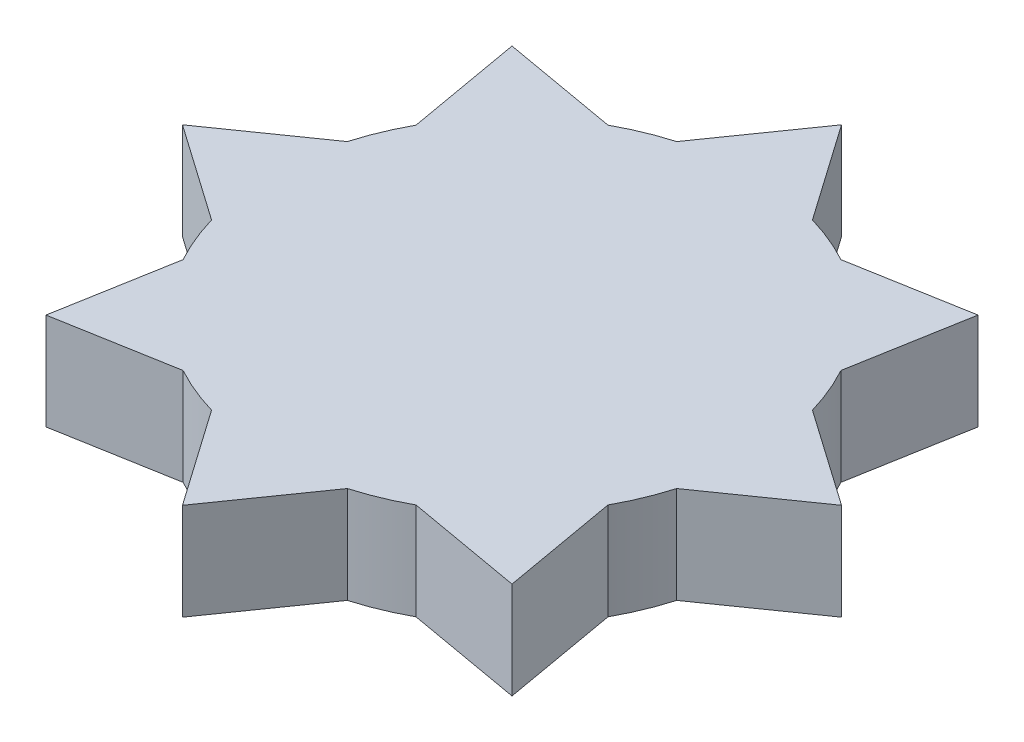
ISO-10303-21;
HEADER;
FILE_DESCRIPTION(('STEP AP214'),'2;1');
FILE_NAME('part.step','',(''),(''),'','','');
FILE_SCHEMA(('AUTOMOTIVE_DESIGN { 1 0 10303 214 1 1 1 1 }'));
ENDSEC;
DATA;
#1=APPLICATION_CONTEXT('core data for automotive mechanical design processes');
#2=APPLICATION_PROTOCOL_DEFINITION('international standard','automotive_design',2000,#1);
#3=PRODUCT_CONTEXT('',#1,'mechanical');
#4=PRODUCT('Part','Part','',(#3));
#5=PRODUCT_RELATED_PRODUCT_CATEGORY('part','',(#4));
#6=PRODUCT_DEFINITION_FORMATION('','',#4);
#7=PRODUCT_DEFINITION_CONTEXT('part definition',#1,'design');
#8=PRODUCT_DEFINITION('design','',#6,#7);
#9=PRODUCT_DEFINITION_SHAPE('','',#8);
#10=(LENGTH_UNIT() NAMED_UNIT(*) SI_UNIT(.MILLI.,.METRE.));
#11=(NAMED_UNIT(*) PLANE_ANGLE_UNIT() SI_UNIT($,.RADIAN.));
#12=(NAMED_UNIT(*) SI_UNIT($,.STERADIAN.) SOLID_ANGLE_UNIT());
#13=UNCERTAINTY_MEASURE_WITH_UNIT(LENGTH_MEASURE(1.E-05),#10,'distance_accuracy_value','');
#14=(GEOMETRIC_REPRESENTATION_CONTEXT(3) GLOBAL_UNCERTAINTY_ASSIGNED_CONTEXT((#13)) GLOBAL_UNIT_ASSIGNED_CONTEXT((#10,
#11,#12)) REPRESENTATION_CONTEXT('',''));
#15=CARTESIAN_POINT('',(0.,0.,0.));
#16=DIRECTION('',(0.,0.,1.));
#17=DIRECTION('',(1.,0.,0.));
#18=AXIS2_PLACEMENT_3D('',#15,#16,#17);
#19=CARTESIAN_POINT('',(15.9747745533604,10.,-11.1856575634635));
#20=DIRECTION('',(0.819152044288995,0.,-0.573576436351041));
#21=DIRECTION('',(-0.573576436351041,0.,-0.819152044288995));
#22=AXIS2_PLACEMENT_3D('',#19,#20,#21);
#23=PLANE('',#22);
#24=DIRECTION('',(0.573576436351042,0.,0.819152044288995));
#25=VECTOR('',#24,1.);
#26=CARTESIAN_POINT('',(15.9747745533604,0.,-11.1856575634635));
#27=LINE('',#26,#25);
#28=CARTESIAN_POINT('',(0.,0.,-34.));
#29=VERTEX_POINT('',#28);
#30=CARTESIAN_POINT('',(7.00260814364315,0.,-23.9992391376598));
#31=VERTEX_POINT('',#30);
#32=EDGE_CURVE('E226',#29,#31,#27,.T.);
#33=ORIENTED_EDGE('',*,*,#32,.F.);
#34=DIRECTION('',(0.,-1.,0.));
#35=VECTOR('',#34,1.);
#36=CARTESIAN_POINT('',(0.,10.,-34.));
#37=LINE('',#36,#35);
#38=CARTESIAN_POINT('',(0.,10.,-34.));
#39=VERTEX_POINT('',#38);
#40=EDGE_CURVE('E11',#39,#29,#37,.T.);
#41=ORIENTED_EDGE('',*,*,#40,.F.);
#42=DIRECTION('',(0.573576436351042,0.,0.819152044288995));
#43=VECTOR('',#42,1.);
#44=CARTESIAN_POINT('',(15.9747745533604,10.,-11.1856575634635));
#45=LINE('',#44,#43);
#46=CARTESIAN_POINT('',(7.00260814364315,10.,-23.9992391376598));
#47=VERTEX_POINT('',#46);
#48=EDGE_CURVE('E450',#39,#47,#45,.T.);
#49=ORIENTED_EDGE('',*,*,#48,.T.);
#50=DIRECTION('',(0.,-1.,0.));
#51=VECTOR('',#50,1.);
#52=CARTESIAN_POINT('',(7.00260814364315,10.,-23.9992391376598));
#53=LINE('',#52,#51);
#54=EDGE_CURVE('E133',#47,#31,#53,.T.);
#55=ORIENTED_EDGE('',*,*,#54,.T.);
#56=EDGE_LOOP('',(#33,#41,#49,#55));
#57=FACE_BOUND('',#56,.T.);
#58=ADVANCED_FACE('F35',(#57),#23,.T.);
#59=CARTESIAN_POINT('',(-15.9747745533604,10.,-11.1856575634635));
#60=DIRECTION('',(0.819152044288995,0.,0.573576436351041));
#61=DIRECTION('',(0.573576436351041,0.,-0.819152044288995));
#62=AXIS2_PLACEMENT_3D('',#59,#60,#61);
#63=PLANE('',#62);
#64=DIRECTION('',(-0.573576436351042,0.,0.819152044288995));
#65=VECTOR('',#64,1.);
#66=CARTESIAN_POINT('',(-15.9747745533604,0.,-11.1856575634635));
#67=LINE('',#66,#65);
#68=CARTESIAN_POINT('',(-7.00260814364315,0.,-23.9992391376598));
#69=VERTEX_POINT('',#68);
#70=EDGE_CURVE('E229',#29,#69,#67,.T.);
#71=ORIENTED_EDGE('',*,*,#70,.T.);
#72=DIRECTION('',(0.,-1.,0.));
#73=VECTOR('',#72,1.);
#74=CARTESIAN_POINT('',(-7.00260814364315,10.,-23.9992391376598));
#75=LINE('',#74,#73);
#76=CARTESIAN_POINT('',(-7.00260814364315,10.,-23.9992391376598));
#77=VERTEX_POINT('',#76);
#78=EDGE_CURVE('E43',#77,#69,#75,.T.);
#79=ORIENTED_EDGE('',*,*,#78,.F.);
#80=DIRECTION('',(-0.573576436351042,0.,0.819152044288995));
#81=VECTOR('',#80,1.);
#82=CARTESIAN_POINT('',(-15.9747745533604,10.,-11.1856575634635));
#83=LINE('',#82,#81);
#84=EDGE_CURVE('E342',#39,#77,#83,.T.);
#85=ORIENTED_EDGE('',*,*,#84,.F.);
#86=ORIENTED_EDGE('',*,*,#40,.T.);
#87=EDGE_LOOP('',(#71,#79,#85,#86));
#88=FACE_BOUND('',#87,.T.);
#89=ADVANCED_FACE('F452',(#88),#63,.F.);
#90=CARTESIAN_POINT('',(0.,10.,0.));
#91=DIRECTION('',(0.,-1.,0.));
#92=DIRECTION('',(0.,0.,-1.));
#93=AXIS2_PLACEMENT_3D('',#90,#91,#92);
#94=CYLINDRICAL_SURFACE('',#93,25.);
#95=CARTESIAN_POINT('',(0.,0.,0.));
#96=DIRECTION('',(0.,1.,0.));
#97=DIRECTION('',(0.,0.,1.));
#98=AXIS2_PLACEMENT_3D('',#95,#96,#97);
#99=CIRCLE('',#98,25.);
#100=CARTESIAN_POINT('',(-12.0184330331944,0.,-21.9216164419192));
#101=VERTEX_POINT('',#100);
#102=EDGE_CURVE('E231',#69,#101,#99,.T.);
#103=ORIENTED_EDGE('',*,*,#102,.T.);
#104=DIRECTION('',(0.,-1.,0.));
#105=VECTOR('',#104,1.);
#106=CARTESIAN_POINT('',(-12.0184330331944,10.,-21.9216164419192));
#107=LINE('',#106,#105);
#108=CARTESIAN_POINT('',(-12.0184330331944,10.,-21.9216164419192));
#109=VERTEX_POINT('',#108);
#110=EDGE_CURVE('E316',#109,#101,#107,.T.);
#111=ORIENTED_EDGE('',*,*,#110,.F.);
#112=CARTESIAN_POINT('',(0.,10.,0.));
#113=DIRECTION('',(0.,1.,0.));
#114=DIRECTION('',(0.,0.,1.));
#115=AXIS2_PLACEMENT_3D('',#112,#113,#114);
#116=CIRCLE('',#115,25.);
#117=EDGE_CURVE('E324',#77,#109,#116,.T.);
#118=ORIENTED_EDGE('',*,*,#117,.F.);
#119=ORIENTED_EDGE('',*,*,#78,.T.);
#120=EDGE_LOOP('',(#103,#111,#118,#119));
#121=FACE_BOUND('',#120,.T.);
#122=ADVANCED_FACE('F322',(#121),#94,.T.);
#123=CARTESIAN_POINT('',(3.38641709945205,10.,-19.205325729763));
#124=DIRECTION('',(0.173648177666948,0.,-0.984807753012205));
#125=DIRECTION('',(-0.984807753012205,0.,-0.173648177666948));
#126=AXIS2_PLACEMENT_3D('',#123,#124,#125);
#127=PLANE('',#126);
#128=DIRECTION('',(0.984807753012205,0.,0.173648177666948));
#129=VECTOR('',#128,1.);
#130=CARTESIAN_POINT('',(3.38641709945205,0.,-19.205325729763));
#131=LINE('',#130,#129);
#132=CARTESIAN_POINT('',(-24.0416305603423,0.,-24.0416305603429));
#133=VERTEX_POINT('',#132);
#134=EDGE_CURVE('E234',#133,#101,#131,.T.);
#135=ORIENTED_EDGE('',*,*,#134,.F.);
#136=DIRECTION('',(0.,-1.,0.));
#137=VECTOR('',#136,1.);
#138=CARTESIAN_POINT('',(-24.0416305603423,10.,-24.0416305603429));
#139=LINE('',#138,#137);
#140=CARTESIAN_POINT('',(-24.0416305603423,10.,-24.0416305603429));
#141=VERTEX_POINT('',#140);
#142=EDGE_CURVE('E314',#141,#133,#139,.T.);
#143=ORIENTED_EDGE('',*,*,#142,.F.);
#144=DIRECTION('',(0.984807753012205,0.,0.173648177666948));
#145=VECTOR('',#144,1.);
#146=CARTESIAN_POINT('',(3.38641709945205,10.,-19.205325729763));
#147=LINE('',#146,#145);
#148=EDGE_CURVE('E337',#141,#109,#147,.T.);
#149=ORIENTED_EDGE('',*,*,#148,.T.);
#150=ORIENTED_EDGE('',*,*,#110,.T.);
#151=EDGE_LOOP('',(#135,#143,#149,#150));
#152=FACE_BOUND('',#151,.T.);
#153=ADVANCED_FACE('F333',(#152),#127,.T.);
#154=CARTESIAN_POINT('',(-19.2053257297631,10.,3.38641709945159));
#155=DIRECTION('',(0.984807753012209,0.,-0.173648177666924));
#156=DIRECTION('',(-0.173648177666924,0.,-0.984807753012209));
#157=AXIS2_PLACEMENT_3D('',#154,#155,#156);
#158=PLANE('',#157);
#159=DIRECTION('',(0.173648177666924,0.,0.984807753012209));
#160=VECTOR('',#159,1.);
#161=CARTESIAN_POINT('',(-19.2053257297631,0.,3.38641709945159));
#162=LINE('',#161,#160);
#163=CARTESIAN_POINT('',(-21.9216164419189,0.,-12.0184330331949));
#164=VERTEX_POINT('',#163);
#165=EDGE_CURVE('E239',#133,#164,#162,.T.);
#166=ORIENTED_EDGE('',*,*,#165,.T.);
#167=DIRECTION('',(0.,-1.,0.));
#168=VECTOR('',#167,1.);
#169=CARTESIAN_POINT('',(-21.9216164419189,10.,-12.0184330331949));
#170=LINE('',#169,#168);
#171=CARTESIAN_POINT('',(-21.9216164419189,10.,-12.0184330331949));
#172=VERTEX_POINT('',#171);
#173=EDGE_CURVE('E311',#172,#164,#170,.T.);
#174=ORIENTED_EDGE('',*,*,#173,.F.);
#175=DIRECTION('',(0.173648177666924,0.,0.984807753012209));
#176=VECTOR('',#175,1.);
#177=CARTESIAN_POINT('',(-19.2053257297631,10.,3.38641709945159));
#178=LINE('',#177,#176);
#179=EDGE_CURVE('E338',#141,#172,#178,.T.);
#180=ORIENTED_EDGE('',*,*,#179,.F.);
#181=ORIENTED_EDGE('',*,*,#142,.T.);
#182=EDGE_LOOP('',(#166,#174,#180,#181));
#183=FACE_BOUND('',#182,.T.);
#184=ADVANCED_FACE('F463',(#183),#158,.F.);
#185=CARTESIAN_POINT('',(-23.9992391376597,0.,-7.00260814364341));
#186=VERTEX_POINT('',#185);
#187=EDGE_CURVE('E236',#164,#186,#99,.T.);
#188=ORIENTED_EDGE('',*,*,#187,.T.);
#189=DIRECTION('',(0.,-1.,0.));
#190=VECTOR('',#189,1.);
#191=CARTESIAN_POINT('',(-23.9992391376597,10.,-7.00260814364341));
#192=LINE('',#191,#190);
#193=CARTESIAN_POINT('',(-23.9992391376597,10.,-7.00260814364341));
#194=VERTEX_POINT('',#193);
#195=EDGE_CURVE('E309',#194,#186,#192,.T.);
#196=ORIENTED_EDGE('',*,*,#195,.F.);
#197=EDGE_CURVE('E340',#172,#194,#116,.T.);
#198=ORIENTED_EDGE('',*,*,#197,.F.);
#199=ORIENTED_EDGE('',*,*,#173,.T.);
#200=EDGE_LOOP('',(#188,#196,#198,#199));
#201=FACE_BOUND('',#200,.T.);
#202=ADVANCED_FACE('F388',(#201),#94,.T.);
#203=CARTESIAN_POINT('',(-11.1856575634633,10.,-15.9747745533605));
#204=DIRECTION('',(-0.573576436351033,0.,-0.819152044289001));
#205=DIRECTION('',(-0.819152044289001,0.,0.573576436351033));
#206=AXIS2_PLACEMENT_3D('',#203,#204,#205);
#207=PLANE('',#206);
#208=DIRECTION('',(0.819152044289001,0.,-0.573576436351033));
#209=VECTOR('',#208,1.);
#210=CARTESIAN_POINT('',(-11.1856575634633,0.,-15.9747745533605));
#211=LINE('',#210,#209);
#212=CARTESIAN_POINT('',(-34.,0.,-3.57353036051222E-13));
#213=VERTEX_POINT('',#212);
#214=EDGE_CURVE('E241',#213,#186,#211,.T.);
#215=ORIENTED_EDGE('',*,*,#214,.F.);
#216=DIRECTION('',(0.,-1.,0.));
#217=VECTOR('',#216,1.);
#218=CARTESIAN_POINT('',(-34.,10.,-3.57353036051222E-13));
#219=LINE('',#218,#217);
#220=CARTESIAN_POINT('',(-34.,10.,-3.57353036051222E-13));
#221=VERTEX_POINT('',#220);
#222=EDGE_CURVE('E307',#221,#213,#219,.T.);
#223=ORIENTED_EDGE('',*,*,#222,.F.);
#224=DIRECTION('',(0.819152044289001,0.,-0.573576436351033));
#225=VECTOR('',#224,1.);
#226=CARTESIAN_POINT('',(-11.1856575634633,10.,-15.9747745533605));
#227=LINE('',#226,#225);
#228=EDGE_CURVE('E345',#221,#194,#227,.T.);
#229=ORIENTED_EDGE('',*,*,#228,.T.);
#230=ORIENTED_EDGE('',*,*,#195,.T.);
#231=EDGE_LOOP('',(#215,#223,#229,#230));
#232=FACE_BOUND('',#231,.T.);
#233=ADVANCED_FACE('F391',(#232),#207,.T.);
#234=CARTESIAN_POINT('',(-11.1856575634636,10.,15.9747745533603));
#235=DIRECTION('',(0.57357643635105,0.,-0.819152044288989));
#236=DIRECTION('',(-0.819152044288989,0.,-0.57357643635105));
#237=AXIS2_PLACEMENT_3D('',#234,#235,#236);
#238=PLANE('',#237);
#239=DIRECTION('',(0.819152044288989,0.,0.57357643635105));
#240=VECTOR('',#239,1.);
#241=CARTESIAN_POINT('',(-11.1856575634636,0.,15.9747745533603));
#242=LINE('',#241,#240);
#243=CARTESIAN_POINT('',(-23.9992391376599,0.,7.0026081436429));
#244=VERTEX_POINT('',#243);
#245=EDGE_CURVE('E244',#213,#244,#242,.T.);
#246=ORIENTED_EDGE('',*,*,#245,.T.);
#247=DIRECTION('',(0.,-1.,0.));
#248=VECTOR('',#247,1.);
#249=CARTESIAN_POINT('',(-23.9992391376599,10.,7.0026081436429));
#250=LINE('',#249,#248);
#251=CARTESIAN_POINT('',(-23.9992391376599,10.,7.0026081436429));
#252=VERTEX_POINT('',#251);
#253=EDGE_CURVE('E304',#252,#244,#250,.T.);
#254=ORIENTED_EDGE('',*,*,#253,.F.);
#255=DIRECTION('',(0.819152044288989,0.,0.57357643635105));
#256=VECTOR('',#255,1.);
#257=CARTESIAN_POINT('',(-11.1856575634636,10.,15.9747745533603));
#258=LINE('',#257,#256);
#259=EDGE_CURVE('E348',#221,#252,#258,.T.);
#260=ORIENTED_EDGE('',*,*,#259,.F.);
#261=ORIENTED_EDGE('',*,*,#222,.T.);
#262=EDGE_LOOP('',(#246,#254,#260,#261));
#263=FACE_BOUND('',#262,.T.);
#264=ADVANCED_FACE('F396',(#263),#238,.F.);
#265=CARTESIAN_POINT('',(-21.9216164419192,0.,12.0184330331944));
#266=VERTEX_POINT('',#265);
#267=EDGE_CURVE('E246',#244,#266,#99,.T.);
#268=ORIENTED_EDGE('',*,*,#267,.T.);
#269=DIRECTION('',(0.,-1.,0.));
#270=VECTOR('',#269,1.);
#271=CARTESIAN_POINT('',(-21.9216164419192,10.,12.0184330331944));
#272=LINE('',#271,#270);
#273=CARTESIAN_POINT('',(-21.9216164419192,10.,12.0184330331944));
#274=VERTEX_POINT('',#273);
#275=EDGE_CURVE('E302',#274,#266,#272,.T.);
#276=ORIENTED_EDGE('',*,*,#275,.F.);
#277=EDGE_CURVE('E350',#252,#274,#116,.T.);
#278=ORIENTED_EDGE('',*,*,#277,.F.);
#279=ORIENTED_EDGE('',*,*,#253,.T.);
#280=EDGE_LOOP('',(#268,#276,#278,#279));
#281=FACE_BOUND('',#280,.T.);
#282=ADVANCED_FACE('F400',(#281),#94,.T.);
#283=CARTESIAN_POINT('',(-19.205325729763,10.,-3.38641709945199));
#284=DIRECTION('',(-0.984807753012206,0.,-0.173648177666944));
#285=DIRECTION('',(-0.173648177666944,0.,0.984807753012206));
#286=AXIS2_PLACEMENT_3D('',#283,#284,#285);
#287=PLANE('',#286);
#288=DIRECTION('',(0.173648177666944,0.,-0.984807753012206));
#289=VECTOR('',#288,1.);
#290=CARTESIAN_POINT('',(-19.205325729763,0.,-3.38641709945199));
#291=LINE('',#290,#289);
#292=CARTESIAN_POINT('',(-24.0416305603428,0.,24.0416305603424));
#293=VERTEX_POINT('',#292);
#294=EDGE_CURVE('E247',#293,#266,#291,.T.);
#295=ORIENTED_EDGE('',*,*,#294,.F.);
#296=DIRECTION('',(0.,-1.,0.));
#297=VECTOR('',#296,1.);
#298=CARTESIAN_POINT('',(-24.0416305603428,10.,24.0416305603424));
#299=LINE('',#298,#297);
#300=CARTESIAN_POINT('',(-24.0416305603428,10.,24.0416305603424));
#301=VERTEX_POINT('',#300);
#302=EDGE_CURVE('E300',#301,#293,#299,.T.);
#303=ORIENTED_EDGE('',*,*,#302,.F.);
#304=DIRECTION('',(0.173648177666944,0.,-0.984807753012206));
#305=VECTOR('',#304,1.);
#306=CARTESIAN_POINT('',(-19.205325729763,10.,-3.38641709945199));
#307=LINE('',#306,#305);
#308=EDGE_CURVE('E351',#301,#274,#307,.T.);
#309=ORIENTED_EDGE('',*,*,#308,.T.);
#310=ORIENTED_EDGE('',*,*,#275,.T.);
#311=EDGE_LOOP('',(#295,#303,#309,#310));
#312=FACE_BOUND('',#311,.T.);
#313=ADVANCED_FACE('F403',(#312),#287,.T.);
#314=CARTESIAN_POINT('',(3.38641709945166,10.,19.2053257297631));
#315=DIRECTION('',(-0.173648177666927,0.,-0.984807753012209));
#316=DIRECTION('',(-0.984807753012209,0.,0.173648177666927));
#317=AXIS2_PLACEMENT_3D('',#314,#315,#316);
#318=PLANE('',#317);
#319=DIRECTION('',(0.984807753012209,0.,-0.173648177666927));
#320=VECTOR('',#319,1.);
#321=CARTESIAN_POINT('',(3.38641709945166,0.,19.2053257297631));
#322=LINE('',#321,#320);
#323=CARTESIAN_POINT('',(-12.0184330331948,0.,21.921616441919));
#324=VERTEX_POINT('',#323);
#325=EDGE_CURVE('E250',#293,#324,#322,.T.);
#326=ORIENTED_EDGE('',*,*,#325,.T.);
#327=DIRECTION('',(0.,-1.,0.));
#328=VECTOR('',#327,1.);
#329=CARTESIAN_POINT('',(-12.0184330331948,10.,21.921616441919));
#330=LINE('',#329,#328);
#331=CARTESIAN_POINT('',(-12.0184330331948,10.,21.921616441919));
#332=VERTEX_POINT('',#331);
#333=EDGE_CURVE('E297',#332,#324,#330,.T.);
#334=ORIENTED_EDGE('',*,*,#333,.F.);
#335=DIRECTION('',(0.984807753012209,0.,-0.173648177666927));
#336=VECTOR('',#335,1.);
#337=CARTESIAN_POINT('',(3.38641709945166,10.,19.2053257297631));
#338=LINE('',#337,#336);
#339=EDGE_CURVE('E354',#301,#332,#338,.T.);
#340=ORIENTED_EDGE('',*,*,#339,.F.);
#341=ORIENTED_EDGE('',*,*,#302,.T.);
#342=EDGE_LOOP('',(#326,#334,#340,#341));
#343=FACE_BOUND('',#342,.T.);
#344=ADVANCED_FACE('F407',(#343),#318,.F.);
#345=CARTESIAN_POINT('',(-7.00260814364332,0.,23.9992391376598));
#346=VERTEX_POINT('',#345);
#347=EDGE_CURVE('E252',#324,#346,#99,.T.);
#348=ORIENTED_EDGE('',*,*,#347,.T.);
#349=DIRECTION('',(0.,-1.,0.));
#350=VECTOR('',#349,1.);
#351=CARTESIAN_POINT('',(-7.00260814364332,10.,23.9992391376598));
#352=LINE('',#351,#350);
#353=CARTESIAN_POINT('',(-7.00260814364332,10.,23.9992391376598));
#354=VERTEX_POINT('',#353);
#355=EDGE_CURVE('E295',#354,#346,#352,.T.);
#356=ORIENTED_EDGE('',*,*,#355,.F.);
#357=EDGE_CURVE('E356',#332,#354,#116,.T.);
#358=ORIENTED_EDGE('',*,*,#357,.F.);
#359=ORIENTED_EDGE('',*,*,#333,.T.);
#360=EDGE_LOOP('',(#348,#356,#358,#359));
#361=FACE_BOUND('',#360,.T.);
#362=ADVANCED_FACE('F412',(#361),#94,.T.);
#363=CARTESIAN_POINT('',(-15.9747745533605,10.,11.1856575634633));
#364=DIRECTION('',(-0.819152044288999,0.,0.573576436351036));
#365=DIRECTION('',(0.573576436351036,0.,0.819152044288999));
#366=AXIS2_PLACEMENT_3D('',#363,#364,#365);
#367=PLANE('',#366);
#368=DIRECTION('',(-0.573576436351036,0.,-0.819152044288999));
#369=VECTOR('',#368,1.);
#370=CARTESIAN_POINT('',(-15.9747745533605,0.,11.1856575634633));
#371=LINE('',#370,#369);
#372=CARTESIAN_POINT('',(-2.35922392732846E-13,0.,34.));
#373=VERTEX_POINT('',#372);
#374=EDGE_CURVE('E253',#373,#346,#371,.T.);
#375=ORIENTED_EDGE('',*,*,#374,.F.);
#376=DIRECTION('',(0.,-1.,0.));
#377=VECTOR('',#376,1.);
#378=CARTESIAN_POINT('',(-2.35922392732846E-13,10.,34.));
#379=LINE('',#378,#377);
#380=CARTESIAN_POINT('',(-2.35922392732846E-13,10.,34.));
#381=VERTEX_POINT('',#380);
#382=EDGE_CURVE('E293',#381,#373,#379,.T.);
#383=ORIENTED_EDGE('',*,*,#382,.F.);
#384=DIRECTION('',(-0.573576436351036,0.,-0.819152044288999));
#385=VECTOR('',#384,1.);
#386=CARTESIAN_POINT('',(-15.9747745533605,10.,11.1856575634633));
#387=LINE('',#386,#385);
#388=EDGE_CURVE('E357',#381,#354,#387,.T.);
#389=ORIENTED_EDGE('',*,*,#388,.T.);
#390=ORIENTED_EDGE('',*,*,#355,.T.);
#391=EDGE_LOOP('',(#375,#383,#389,#390));
#392=FACE_BOUND('',#391,.T.);
#393=ADVANCED_FACE('F415',(#392),#367,.T.);
#394=CARTESIAN_POINT('',(15.9747745533603,10.,11.1856575634636));
#395=DIRECTION('',(-0.819152044288991,0.,-0.573576436351047));
#396=DIRECTION('',(-0.573576436351047,0.,0.819152044288991));
#397=AXIS2_PLACEMENT_3D('',#394,#395,#396);
#398=PLANE('',#397);
#399=DIRECTION('',(0.573576436351047,0.,-0.819152044288991));
#400=VECTOR('',#399,1.);
#401=CARTESIAN_POINT('',(15.9747745533603,0.,11.1856575634636));
#402=LINE('',#401,#400);
#403=CARTESIAN_POINT('',(7.00260814364299,0.,23.9992391376599));
#404=VERTEX_POINT('',#403);
#405=EDGE_CURVE('E256',#373,#404,#402,.T.);
#406=ORIENTED_EDGE('',*,*,#405,.T.);
#407=DIRECTION('',(0.,-1.,0.));
#408=VECTOR('',#407,1.);
#409=CARTESIAN_POINT('',(7.00260814364299,10.,23.9992391376599));
#410=LINE('',#409,#408);
#411=CARTESIAN_POINT('',(7.00260814364299,10.,23.9992391376599));
#412=VERTEX_POINT('',#411);
#413=EDGE_CURVE('E290',#412,#404,#410,.T.);
#414=ORIENTED_EDGE('',*,*,#413,.F.);
#415=DIRECTION('',(0.573576436351047,0.,-0.819152044288991));
#416=VECTOR('',#415,1.);
#417=CARTESIAN_POINT('',(15.9747745533603,10.,11.1856575634636));
#418=LINE('',#417,#416);
#419=EDGE_CURVE('E360',#381,#412,#418,.T.);
#420=ORIENTED_EDGE('',*,*,#419,.F.);
#421=ORIENTED_EDGE('',*,*,#382,.T.);
#422=EDGE_LOOP('',(#406,#414,#420,#421));
#423=FACE_BOUND('',#422,.T.);
#424=ADVANCED_FACE('F419',(#423),#398,.F.);
#425=CARTESIAN_POINT('',(12.0184330331945,0.,21.9216164419191));
#426=VERTEX_POINT('',#425);
#427=EDGE_CURVE('E258',#404,#426,#99,.T.);
#428=ORIENTED_EDGE('',*,*,#427,.T.);
#429=DIRECTION('',(0.,-1.,0.));
#430=VECTOR('',#429,1.);
#431=CARTESIAN_POINT('',(12.0184330331945,10.,21.9216164419191));
#432=LINE('',#431,#430);
#433=CARTESIAN_POINT('',(12.0184330331945,10.,21.9216164419191));
#434=VERTEX_POINT('',#433);
#435=EDGE_CURVE('E288',#434,#426,#432,.T.);
#436=ORIENTED_EDGE('',*,*,#435,.F.);
#437=EDGE_CURVE('E362',#412,#434,#116,.T.);
#438=ORIENTED_EDGE('',*,*,#437,.F.);
#439=ORIENTED_EDGE('',*,*,#413,.T.);
#440=EDGE_LOOP('',(#428,#436,#438,#439));
#441=FACE_BOUND('',#440,.T.);
#442=ADVANCED_FACE('F424',(#441),#94,.T.);
#443=CARTESIAN_POINT('',(-3.38641709945192,10.,19.205325729763));
#444=DIRECTION('',(-0.173648177666941,0.,0.984807753012206));
#445=DIRECTION('',(0.984807753012206,0.,0.173648177666941));
#446=AXIS2_PLACEMENT_3D('',#443,#444,#445);
#447=PLANE('',#446);
#448=DIRECTION('',(-0.984807753012206,0.,-0.173648177666941));
#449=VECTOR('',#448,1.);
#450=CARTESIAN_POINT('',(-3.38641709945192,0.,19.205325729763));
#451=LINE('',#450,#449);
#452=CARTESIAN_POINT('',(24.0416305603425,0.,24.0416305603427));
#453=VERTEX_POINT('',#452);
#454=EDGE_CURVE('E259',#453,#426,#451,.T.);
#455=ORIENTED_EDGE('',*,*,#454,.F.);
#456=DIRECTION('',(0.,-1.,0.));
#457=VECTOR('',#456,1.);
#458=CARTESIAN_POINT('',(24.0416305603425,10.,24.0416305603427));
#459=LINE('',#458,#457);
#460=CARTESIAN_POINT('',(24.0416305603425,10.,24.0416305603427));
#461=VERTEX_POINT('',#460);
#462=EDGE_CURVE('E286',#461,#453,#459,.T.);
#463=ORIENTED_EDGE('',*,*,#462,.F.);
#464=DIRECTION('',(-0.984807753012206,0.,-0.173648177666941));
#465=VECTOR('',#464,1.);
#466=CARTESIAN_POINT('',(-3.38641709945192,10.,19.205325729763));
#467=LINE('',#466,#465);
#468=EDGE_CURVE('E363',#461,#434,#467,.T.);
#469=ORIENTED_EDGE('',*,*,#468,.T.);
#470=ORIENTED_EDGE('',*,*,#435,.T.);
#471=EDGE_LOOP('',(#455,#463,#469,#470));
#472=FACE_BOUND('',#471,.T.);
#473=ADVANCED_FACE('F427',(#472),#447,.T.);
#474=CARTESIAN_POINT('',(19.2053257297631,10.,-3.38641709945172));
#475=DIRECTION('',(-0.984807753012208,0.,0.173648177666931));
#476=DIRECTION('',(0.173648177666931,0.,0.984807753012208));
#477=AXIS2_PLACEMENT_3D('',#474,#475,#476);
#478=PLANE('',#477);
#479=DIRECTION('',(-0.173648177666931,0.,-0.984807753012208));
#480=VECTOR('',#479,1.);
#481=CARTESIAN_POINT('',(19.2053257297631,0.,-3.38641709945172));
#482=LINE('',#481,#480);
#483=CARTESIAN_POINT('',(21.921616441919,0.,12.0184330331947));
#484=VERTEX_POINT('',#483);
#485=EDGE_CURVE('E262',#453,#484,#482,.T.);
#486=ORIENTED_EDGE('',*,*,#485,.T.);
#487=DIRECTION('',(0.,-1.,0.));
#488=VECTOR('',#487,1.);
#489=CARTESIAN_POINT('',(21.921616441919,10.,12.0184330331947));
#490=LINE('',#489,#488);
#491=CARTESIAN_POINT('',(21.921616441919,10.,12.0184330331947));
#492=VERTEX_POINT('',#491);
#493=EDGE_CURVE('E283',#492,#484,#490,.T.);
#494=ORIENTED_EDGE('',*,*,#493,.F.);
#495=DIRECTION('',(-0.173648177666931,0.,-0.984807753012208));
#496=VECTOR('',#495,1.);
#497=CARTESIAN_POINT('',(19.2053257297631,10.,-3.38641709945172));
#498=LINE('',#497,#496);
#499=EDGE_CURVE('E366',#461,#492,#498,.T.);
#500=ORIENTED_EDGE('',*,*,#499,.F.);
#501=ORIENTED_EDGE('',*,*,#462,.T.);
#502=EDGE_LOOP('',(#486,#494,#500,#501));
#503=FACE_BOUND('',#502,.T.);
#504=ADVANCED_FACE('F431',(#503),#478,.F.);
#505=CARTESIAN_POINT('',(23.9992391376598,0.,7.00260814364324));
#506=VERTEX_POINT('',#505);
#507=EDGE_CURVE('E264',#484,#506,#99,.T.);
#508=ORIENTED_EDGE('',*,*,#507,.T.);
#509=DIRECTION('',(0.,-1.,0.));
#510=VECTOR('',#509,1.);
#511=CARTESIAN_POINT('',(23.9992391376598,10.,7.00260814364324));
#512=LINE('',#511,#510);
#513=CARTESIAN_POINT('',(23.9992391376598,10.,7.00260814364324));
#514=VERTEX_POINT('',#513);
#515=EDGE_CURVE('E281',#514,#506,#512,.T.);
#516=ORIENTED_EDGE('',*,*,#515,.F.);
#517=EDGE_CURVE('E222',#492,#514,#116,.T.);
#518=ORIENTED_EDGE('',*,*,#517,.F.);
#519=ORIENTED_EDGE('',*,*,#493,.T.);
#520=EDGE_LOOP('',(#508,#516,#518,#519));
#521=FACE_BOUND('',#520,.T.);
#522=ADVANCED_FACE('F436',(#521),#94,.T.);
#523=CARTESIAN_POINT('',(11.1856575634634,10.,15.9747745533604));
#524=DIRECTION('',(0.573576436351039,0.,0.819152044288997));
#525=DIRECTION('',(0.819152044288997,0.,-0.573576436351039));
#526=AXIS2_PLACEMENT_3D('',#523,#524,#525);
#527=PLANE('',#526);
#528=DIRECTION('',(-0.819152044288997,0.,0.573576436351039));
#529=VECTOR('',#528,1.);
#530=CARTESIAN_POINT('',(11.1856575634634,0.,15.9747745533604));
#531=LINE('',#530,#529);
#532=CARTESIAN_POINT('',(34.,0.,1.17961196366423E-13));
#533=VERTEX_POINT('',#532);
#534=EDGE_CURVE('E265',#533,#506,#531,.T.);
#535=ORIENTED_EDGE('',*,*,#534,.F.);
#536=DIRECTION('',(0.,-1.,0.));
#537=VECTOR('',#536,1.);
#538=CARTESIAN_POINT('',(34.,10.,1.17961196366423E-13));
#539=LINE('',#538,#537);
#540=CARTESIAN_POINT('',(34.,10.,1.17961196366423E-13));
#541=VERTEX_POINT('',#540);
#542=EDGE_CURVE('E279',#541,#533,#539,.T.);
#543=ORIENTED_EDGE('',*,*,#542,.F.);
#544=DIRECTION('',(-0.819152044288997,0.,0.573576436351039));
#545=VECTOR('',#544,1.);
#546=CARTESIAN_POINT('',(11.1856575634634,10.,15.9747745533604));
#547=LINE('',#546,#545);
#548=EDGE_CURVE('E367',#541,#514,#547,.T.);
#549=ORIENTED_EDGE('',*,*,#548,.T.);
#550=ORIENTED_EDGE('',*,*,#515,.T.);
#551=EDGE_LOOP('',(#535,#543,#549,#550));
#552=FACE_BOUND('',#551,.T.);
#553=ADVANCED_FACE('F438',(#552),#527,.T.);
#554=CARTESIAN_POINT('',(11.1856575634635,10.,-15.9747745533603));
#555=DIRECTION('',(-0.573576436351044,0.,0.819152044288993));
#556=DIRECTION('',(0.819152044288993,0.,0.573576436351044));
#557=AXIS2_PLACEMENT_3D('',#554,#555,#556);
#558=PLANE('',#557);
#559=DIRECTION('',(-0.819152044288993,0.,-0.573576436351044));
#560=VECTOR('',#559,1.);
#561=CARTESIAN_POINT('',(11.1856575634635,0.,-15.9747745533603));
#562=LINE('',#561,#560);
#563=CARTESIAN_POINT('',(23.9992391376598,0.,-7.00260814364307));
#564=VERTEX_POINT('',#563);
#565=EDGE_CURVE('E268',#533,#564,#562,.T.);
#566=ORIENTED_EDGE('',*,*,#565,.T.);
#567=DIRECTION('',(0.,-1.,0.));
#568=VECTOR('',#567,1.);
#569=CARTESIAN_POINT('',(23.9992391376598,10.,-7.00260814364307));
#570=LINE('',#569,#568);
#571=CARTESIAN_POINT('',(23.9992391376598,10.,-7.00260814364307));
#572=VERTEX_POINT('',#571);
#573=EDGE_CURVE('E276',#572,#564,#570,.T.);
#574=ORIENTED_EDGE('',*,*,#573,.F.);
#575=DIRECTION('',(-0.819152044288993,0.,-0.573576436351044));
#576=VECTOR('',#575,1.);
#577=CARTESIAN_POINT('',(11.1856575634635,10.,-15.9747745533603));
#578=LINE('',#577,#576);
#579=EDGE_CURVE('E220',#541,#572,#578,.T.);
#580=ORIENTED_EDGE('',*,*,#579,.F.);
#581=ORIENTED_EDGE('',*,*,#542,.T.);
#582=EDGE_LOOP('',(#566,#574,#580,#581));
#583=FACE_BOUND('',#582,.T.);
#584=ADVANCED_FACE('F445',(#583),#558,.F.);
#585=CARTESIAN_POINT('',(21.9216164419191,0.,-12.0184330331946));
#586=VERTEX_POINT('',#585);
#587=EDGE_CURVE('E270',#564,#586,#99,.T.);
#588=ORIENTED_EDGE('',*,*,#587,.T.);
#589=DIRECTION('',(0.,-1.,0.));
#590=VECTOR('',#589,1.);
#591=CARTESIAN_POINT('',(21.9216164419191,10.,-12.0184330331946));
#592=LINE('',#591,#590);
#593=CARTESIAN_POINT('',(21.9216164419191,10.,-12.0184330331946));
#594=VERTEX_POINT('',#593);
#595=EDGE_CURVE('E209',#594,#586,#592,.T.);
#596=ORIENTED_EDGE('',*,*,#595,.F.);
#597=EDGE_CURVE('E217',#572,#594,#116,.T.);
#598=ORIENTED_EDGE('',*,*,#597,.F.);
#599=ORIENTED_EDGE('',*,*,#573,.T.);
#600=EDGE_LOOP('',(#588,#596,#598,#599));
#601=FACE_BOUND('',#600,.T.);
#602=ADVANCED_FACE('F447',(#601),#94,.T.);
#603=CARTESIAN_POINT('',(19.205325729763,10.,3.38641709945186));
#604=DIRECTION('',(0.984807753012207,0.,0.173648177666938));
#605=DIRECTION('',(0.173648177666938,0.,-0.984807753012207));
#606=AXIS2_PLACEMENT_3D('',#603,#604,#605);
#607=PLANE('',#606);
#608=DIRECTION('',(-0.173648177666938,0.,0.984807753012207));
#609=VECTOR('',#608,1.);
#610=CARTESIAN_POINT('',(19.205325729763,0.,3.38641709945186));
#611=LINE('',#610,#609);
#612=CARTESIAN_POINT('',(24.0416305603427,0.,-24.0416305603426));
#613=VERTEX_POINT('',#612);
#614=EDGE_CURVE('E208',#613,#586,#611,.T.);
#615=ORIENTED_EDGE('',*,*,#614,.F.);
#616=DIRECTION('',(0.,-1.,0.));
#617=VECTOR('',#616,1.);
#618=CARTESIAN_POINT('',(24.0416305603427,10.,-24.0416305603426));
#619=LINE('',#618,#617);
#620=CARTESIAN_POINT('',(24.0416305603427,10.,-24.0416305603426));
#621=VERTEX_POINT('',#620);
#622=EDGE_CURVE('E202',#621,#613,#619,.T.);
#623=ORIENTED_EDGE('',*,*,#622,.F.);
#624=DIRECTION('',(-0.173648177666938,0.,0.984807753012207));
#625=VECTOR('',#624,1.);
#626=CARTESIAN_POINT('',(19.205325729763,10.,3.38641709945186));
#627=LINE('',#626,#625);
#628=EDGE_CURVE('E206',#621,#594,#627,.T.);
#629=ORIENTED_EDGE('',*,*,#628,.T.);
#630=ORIENTED_EDGE('',*,*,#595,.T.);
#631=EDGE_LOOP('',(#615,#623,#629,#630));
#632=FACE_BOUND('',#631,.T.);
#633=ADVANCED_FACE('F204',(#632),#607,.T.);
#634=CARTESIAN_POINT('',(-3.38641709945179,10.,-19.205325729763));
#635=DIRECTION('',(0.173648177666934,0.,0.984807753012207));
#636=DIRECTION('',(0.984807753012207,0.,-0.173648177666934));
#637=AXIS2_PLACEMENT_3D('',#634,#635,#636);
#638=PLANE('',#637);
#639=DIRECTION('',(-0.984807753012207,0.,0.173648177666934));
#640=VECTOR('',#639,1.);
#641=CARTESIAN_POINT('',(-3.38641709945179,0.,-19.205325729763));
#642=LINE('',#641,#640);
#643=CARTESIAN_POINT('',(12.0184330331947,0.,-21.921616441919));
#644=VERTEX_POINT('',#643);
#645=EDGE_CURVE('E126',#613,#644,#642,.T.);
#646=ORIENTED_EDGE('',*,*,#645,.T.);
#647=DIRECTION('',(0.,-1.,0.));
#648=VECTOR('',#647,1.);
#649=CARTESIAN_POINT('',(12.0184330331947,10.,-21.921616441919));
#650=LINE('',#649,#648);
#651=CARTESIAN_POINT('',(12.0184330331947,10.,-21.921616441919));
#652=VERTEX_POINT('',#651);
#653=EDGE_CURVE('E210',#652,#644,#650,.T.);
#654=ORIENTED_EDGE('',*,*,#653,.F.);
#655=DIRECTION('',(-0.984807753012207,0.,0.173648177666934));
#656=VECTOR('',#655,1.);
#657=CARTESIAN_POINT('',(-3.38641709945179,10.,-19.205325729763));
#658=LINE('',#657,#656);
#659=EDGE_CURVE('E212',#621,#652,#658,.T.);
#660=ORIENTED_EDGE('',*,*,#659,.F.);
#661=ORIENTED_EDGE('',*,*,#622,.T.);
#662=EDGE_LOOP('',(#646,#654,#660,#661));
#663=FACE_BOUND('',#662,.T.);
#664=ADVANCED_FACE('F213',(#663),#638,.F.);
#665=EDGE_CURVE('E235',#644,#31,#99,.T.);
#666=ORIENTED_EDGE('',*,*,#665,.T.);
#667=ORIENTED_EDGE('',*,*,#54,.F.);
#668=EDGE_CURVE('E51',#652,#47,#116,.T.);
#669=ORIENTED_EDGE('',*,*,#668,.F.);
#670=ORIENTED_EDGE('',*,*,#653,.T.);
#671=EDGE_LOOP('',(#666,#667,#669,#670));
#672=FACE_BOUND('',#671,.T.);
#673=ADVANCED_FACE('F459',(#672),#94,.T.);
#674=CARTESIAN_POINT('',(0.,10.,0.));
#675=DIRECTION('',(0.,1.,0.));
#676=DIRECTION('',(0.,0.,1.));
#677=AXIS2_PLACEMENT_3D('',#674,#675,#676);
#678=PLANE('',#677);
#679=ORIENTED_EDGE('',*,*,#48,.F.);
#680=ORIENTED_EDGE('',*,*,#84,.T.);
#681=ORIENTED_EDGE('',*,*,#117,.T.);
#682=ORIENTED_EDGE('',*,*,#148,.F.);
#683=ORIENTED_EDGE('',*,*,#179,.T.);
#684=ORIENTED_EDGE('',*,*,#197,.T.);
#685=ORIENTED_EDGE('',*,*,#228,.F.);
#686=ORIENTED_EDGE('',*,*,#259,.T.);
#687=ORIENTED_EDGE('',*,*,#277,.T.);
#688=ORIENTED_EDGE('',*,*,#308,.F.);
#689=ORIENTED_EDGE('',*,*,#339,.T.);
#690=ORIENTED_EDGE('',*,*,#357,.T.);
#691=ORIENTED_EDGE('',*,*,#388,.F.);
#692=ORIENTED_EDGE('',*,*,#419,.T.);
#693=ORIENTED_EDGE('',*,*,#437,.T.);
#694=ORIENTED_EDGE('',*,*,#468,.F.);
#695=ORIENTED_EDGE('',*,*,#499,.T.);
#696=ORIENTED_EDGE('',*,*,#517,.T.);
#697=ORIENTED_EDGE('',*,*,#548,.F.);
#698=ORIENTED_EDGE('',*,*,#579,.T.);
#699=ORIENTED_EDGE('',*,*,#597,.T.);
#700=ORIENTED_EDGE('',*,*,#628,.F.);
#701=ORIENTED_EDGE('',*,*,#659,.T.);
#702=ORIENTED_EDGE('',*,*,#668,.T.);
#703=EDGE_LOOP('',(#679,#680,#681,#682,#683,#684,#685,#686,#687,#688,#689,#690,#691,#692,#693,
#694,#695,#696,#697,#698,#699,#700,#701,#702));
#704=FACE_BOUND('',#703,.T.);
#705=ADVANCED_FACE('F215',(#704),#678,.T.);
#706=CARTESIAN_POINT('',(0.,0.,0.));
#707=DIRECTION('',(0.,1.,0.));
#708=DIRECTION('',(0.,0.,1.));
#709=AXIS2_PLACEMENT_3D('',#706,#707,#708);
#710=PLANE('',#709);
#711=ORIENTED_EDGE('',*,*,#32,.T.);
#712=ORIENTED_EDGE('',*,*,#665,.F.);
#713=ORIENTED_EDGE('',*,*,#645,.F.);
#714=ORIENTED_EDGE('',*,*,#614,.T.);
#715=ORIENTED_EDGE('',*,*,#587,.F.);
#716=ORIENTED_EDGE('',*,*,#565,.F.);
#717=ORIENTED_EDGE('',*,*,#534,.T.);
#718=ORIENTED_EDGE('',*,*,#507,.F.);
#719=ORIENTED_EDGE('',*,*,#485,.F.);
#720=ORIENTED_EDGE('',*,*,#454,.T.);
#721=ORIENTED_EDGE('',*,*,#427,.F.);
#722=ORIENTED_EDGE('',*,*,#405,.F.);
#723=ORIENTED_EDGE('',*,*,#374,.T.);
#724=ORIENTED_EDGE('',*,*,#347,.F.);
#725=ORIENTED_EDGE('',*,*,#325,.F.);
#726=ORIENTED_EDGE('',*,*,#294,.T.);
#727=ORIENTED_EDGE('',*,*,#267,.F.);
#728=ORIENTED_EDGE('',*,*,#245,.F.);
#729=ORIENTED_EDGE('',*,*,#214,.T.);
#730=ORIENTED_EDGE('',*,*,#187,.F.);
#731=ORIENTED_EDGE('',*,*,#165,.F.);
#732=ORIENTED_EDGE('',*,*,#134,.T.);
#733=ORIENTED_EDGE('',*,*,#102,.F.);
#734=ORIENTED_EDGE('',*,*,#70,.F.);
#735=EDGE_LOOP('',(#711,#712,#713,#714,#715,#716,#717,#718,#719,#720,#721,#722,#723,#724,#725,
#726,#727,#728,#729,#730,#731,#732,#733,#734));
#736=FACE_BOUND('',#735,.T.);
#737=ADVANCED_FACE('F328',(#736),#710,.F.);
#738=CLOSED_SHELL('',(#58,#89,#122,#153,#184,#202,#233,#264,#282,#313,#344,#362,#393,#424,#442,
#473,#504,#522,#553,#584,#602,#633,#664,#673,#705,#737));
#739=MANIFOLD_SOLID_BREP('B2',#738);
#740=ADVANCED_BREP_SHAPE_REPRESENTATION('',(#18,#739),#14);
#741=SHAPE_DEFINITION_REPRESENTATION(#9,#740);
ENDSEC;
END-ISO-10303-21;
